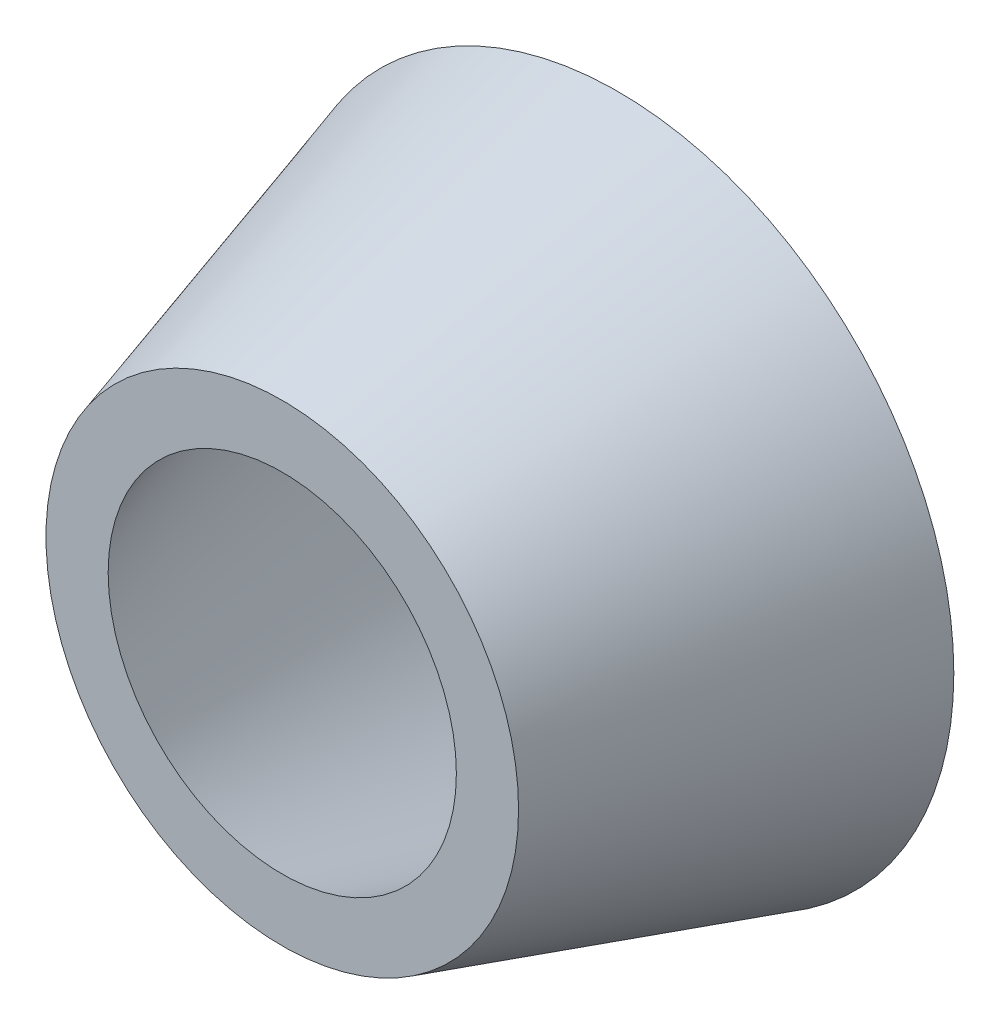
ISO-10303-21;
HEADER;
FILE_DESCRIPTION(('STEP AP214'),'2;1');
FILE_NAME('part.step','',(''),(''),'','','');
FILE_SCHEMA(('AUTOMOTIVE_DESIGN { 1 0 10303 214 1 1 1 1 }'));
ENDSEC;
DATA;
#1=APPLICATION_CONTEXT('core data for automotive mechanical design processes');
#2=APPLICATION_PROTOCOL_DEFINITION('international standard','automotive_design',2000,#1);
#3=PRODUCT_CONTEXT('',#1,'mechanical');
#4=PRODUCT('Part','Part','',(#3));
#5=PRODUCT_RELATED_PRODUCT_CATEGORY('part','',(#4));
#6=PRODUCT_DEFINITION_FORMATION('','',#4);
#7=PRODUCT_DEFINITION_CONTEXT('part definition',#1,'design');
#8=PRODUCT_DEFINITION('design','',#6,#7);
#9=PRODUCT_DEFINITION_SHAPE('','',#8);
#10=(LENGTH_UNIT() NAMED_UNIT(*) SI_UNIT(.MILLI.,.METRE.));
#11=(NAMED_UNIT(*) PLANE_ANGLE_UNIT() SI_UNIT($,.RADIAN.));
#12=(NAMED_UNIT(*) SI_UNIT($,.STERADIAN.) SOLID_ANGLE_UNIT());
#13=UNCERTAINTY_MEASURE_WITH_UNIT(LENGTH_MEASURE(1.E-05),#10,'distance_accuracy_value','');
#14=(GEOMETRIC_REPRESENTATION_CONTEXT(3) GLOBAL_UNCERTAINTY_ASSIGNED_CONTEXT((#13)) GLOBAL_UNIT_ASSIGNED_CONTEXT((#10,
#11,#12)) REPRESENTATION_CONTEXT('',''));
#15=CARTESIAN_POINT('',(0.,0.,0.));
#16=DIRECTION('',(0.,0.,1.));
#17=DIRECTION('',(1.,0.,0.));
#18=AXIS2_PLACEMENT_3D('',#15,#16,#17);
#19=CARTESIAN_POINT('',(0.,19.,0.));
#20=DIRECTION('',(0.,0.,-1.));
#21=DIRECTION('',(-1.,0.,0.));
#22=AXIS2_PLACEMENT_3D('',#19,#20,#21);
#23=PLANE('',#22);
#24=CARTESIAN_POINT('',(0.,0.,0.));
#25=DIRECTION('',(0.,0.,1.));
#26=DIRECTION('',(1.,0.,0.));
#27=AXIS2_PLACEMENT_3D('',#24,#25,#26);
#28=CIRCLE('',#27,14.);
#29=CARTESIAN_POINT('',(14.,0.,0.));
#30=VERTEX_POINT('',#29);
#31=EDGE_CURVE('E10',#30,#30,#28,.T.);
#32=ORIENTED_EDGE('',*,*,#31,.F.);
#33=EDGE_LOOP('',(#32));
#34=FACE_BOUND('',#33,.T.);
#35=CARTESIAN_POINT('',(0.,0.,0.));
#36=DIRECTION('',(0.,0.,1.));
#37=DIRECTION('',(1.,0.,0.));
#38=AXIS2_PLACEMENT_3D('',#35,#36,#37);
#39=CIRCLE('',#38,19.);
#40=CARTESIAN_POINT('',(19.,0.,0.));
#41=VERTEX_POINT('',#40);
#42=EDGE_CURVE('E47',#41,#41,#39,.T.);
#43=ORIENTED_EDGE('',*,*,#42,.T.);
#44=EDGE_LOOP('',(#43));
#45=FACE_BOUND('',#44,.T.);
#46=ADVANCED_FACE('F33',(#34,#45),#23,.F.);
#47=CARTESIAN_POINT('',(0.,0.,0.));
#48=DIRECTION('',(0.,0.,-1.));
#49=DIRECTION('',(-1.,0.,0.));
#50=AXIS2_PLACEMENT_3D('',#47,#48,#49);
#51=CONICAL_SURFACE('',#50,14.,0.288055447050626);
#52=CARTESIAN_POINT('',(0.,0.,-27.));
#53=DIRECTION('',(0.,0.,1.));
#54=DIRECTION('',(1.,0.,0.));
#55=AXIS2_PLACEMENT_3D('',#52,#53,#54);
#56=CIRCLE('',#55,22.);
#57=CARTESIAN_POINT('',(22.,0.,-27.));
#58=VERTEX_POINT('',#57);
#59=EDGE_CURVE('E39',#58,#58,#56,.T.);
#60=ORIENTED_EDGE('',*,*,#59,.F.);
#61=EDGE_LOOP('',(#60));
#62=FACE_BOUND('',#61,.T.);
#63=ORIENTED_EDGE('',*,*,#31,.T.);
#64=EDGE_LOOP('',(#63));
#65=FACE_BOUND('',#64,.T.);
#66=ADVANCED_FACE('F62',(#62,#65),#51,.F.);
#67=CARTESIAN_POINT('',(0.,22.,-27.));
#68=DIRECTION('',(0.,0.,1.));
#69=DIRECTION('',(1.,0.,0.));
#70=AXIS2_PLACEMENT_3D('',#67,#68,#69);
#71=PLANE('',#70);
#72=CARTESIAN_POINT('',(0.,0.,-27.));
#73=DIRECTION('',(0.,0.,1.));
#74=DIRECTION('',(1.,0.,0.));
#75=AXIS2_PLACEMENT_3D('',#72,#73,#74);
#76=CIRCLE('',#75,27.);
#77=CARTESIAN_POINT('',(27.,0.,-27.));
#78=VERTEX_POINT('',#77);
#79=EDGE_CURVE('E43',#78,#78,#76,.T.);
#80=ORIENTED_EDGE('',*,*,#79,.F.);
#81=EDGE_LOOP('',(#80));
#82=FACE_BOUND('',#81,.T.);
#83=ORIENTED_EDGE('',*,*,#59,.T.);
#84=EDGE_LOOP('',(#83));
#85=FACE_BOUND('',#84,.T.);
#86=ADVANCED_FACE('F57',(#82,#85),#71,.F.);
#87=CARTESIAN_POINT('',(0.,0.,-27.));
#88=DIRECTION('',(0.,0.,-1.));
#89=DIRECTION('',(-1.,0.,0.));
#90=AXIS2_PLACEMENT_3D('',#87,#88,#89);
#91=CONICAL_SURFACE('',#90,27.,0.288055447050626);
#92=ORIENTED_EDGE('',*,*,#42,.F.);
#93=EDGE_LOOP('',(#92));
#94=FACE_BOUND('',#93,.T.);
#95=ORIENTED_EDGE('',*,*,#79,.T.);
#96=EDGE_LOOP('',(#95));
#97=FACE_BOUND('',#96,.T.);
#98=ADVANCED_FACE('F54',(#94,#97),#91,.T.);
#99=CLOSED_SHELL('',(#46,#66,#86,#98));
#100=MANIFOLD_SOLID_BREP('B2',#99);
#101=ADVANCED_BREP_SHAPE_REPRESENTATION('',(#18,#100),#14);
#102=SHAPE_DEFINITION_REPRESENTATION(#9,#101);
ENDSEC;
END-ISO-10303-21;
